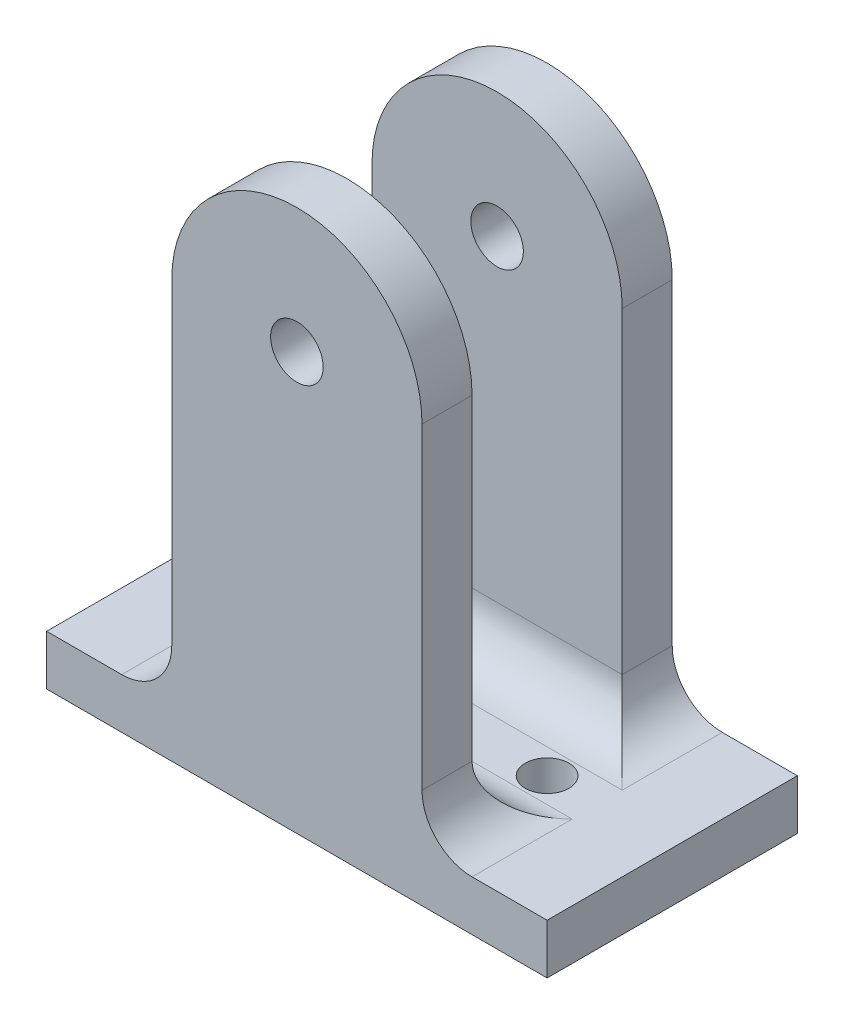
ISO-10303-21;
HEADER;
FILE_DESCRIPTION(('STEP AP214'),'2;1');
FILE_NAME('part.step','',(''),(''),'','','');
FILE_SCHEMA(('AUTOMOTIVE_DESIGN { 1 0 10303 214 1 1 1 1 }'));
ENDSEC;
DATA;
#1=APPLICATION_CONTEXT('core data for automotive mechanical design processes');
#2=APPLICATION_PROTOCOL_DEFINITION('international standard','automotive_design',2000,#1);
#3=PRODUCT_CONTEXT('',#1,'mechanical');
#4=PRODUCT('Part','Part','',(#3));
#5=PRODUCT_RELATED_PRODUCT_CATEGORY('part','',(#4));
#6=PRODUCT_DEFINITION_FORMATION('','',#4);
#7=PRODUCT_DEFINITION_CONTEXT('part definition',#1,'design');
#8=PRODUCT_DEFINITION('design','',#6,#7);
#9=PRODUCT_DEFINITION_SHAPE('','',#8);
#10=(LENGTH_UNIT() NAMED_UNIT(*) SI_UNIT(.MILLI.,.METRE.));
#11=(NAMED_UNIT(*) PLANE_ANGLE_UNIT() SI_UNIT($,.RADIAN.));
#12=(NAMED_UNIT(*) SI_UNIT($,.STERADIAN.) SOLID_ANGLE_UNIT());
#13=UNCERTAINTY_MEASURE_WITH_UNIT(LENGTH_MEASURE(1.E-05),#10,'distance_accuracy_value','');
#14=(GEOMETRIC_REPRESENTATION_CONTEXT(3) GLOBAL_UNCERTAINTY_ASSIGNED_CONTEXT((#13)) GLOBAL_UNIT_ASSIGNED_CONTEXT((#10,
#11,#12)) REPRESENTATION_CONTEXT('',''));
#15=CARTESIAN_POINT('',(0.,0.,0.));
#16=DIRECTION('',(0.,0.,1.));
#17=DIRECTION('',(1.,0.,0.));
#18=AXIS2_PLACEMENT_3D('',#15,#16,#17);
#19=CARTESIAN_POINT('',(0.,7.62,0.));
#20=DIRECTION('',(0.,-1.,0.));
#21=DIRECTION('',(0.,0.,-1.));
#22=AXIS2_PLACEMENT_3D('',#19,#20,#21);
#23=PLANE('',#22);
#24=CARTESIAN_POINT('',(57.15,7.62,-19.05));
#25=DIRECTION('',(0.,1.,0.));
#26=DIRECTION('',(0.,0.,-1.));
#27=AXIS2_PLACEMENT_3D('',#24,#25,#26);
#28=CIRCLE('',#27,3.3274);
#29=CARTESIAN_POINT('',(57.15,7.62,-22.3774));
#30=VERTEX_POINT('',#29);
#31=EDGE_CURVE('E219',#30,#30,#28,.T.);
#32=ORIENTED_EDGE('',*,*,#31,.F.);
#33=EDGE_LOOP('',(#32));
#34=FACE_BOUND('',#33,.T.);
#35=CARTESIAN_POINT('',(19.05,7.62,-19.05));
#36=DIRECTION('',(0.,1.,0.));
#37=DIRECTION('',(0.,0.,1.));
#38=AXIS2_PLACEMENT_3D('',#35,#36,#37);
#39=CIRCLE('',#38,3.3274);
#40=CARTESIAN_POINT('',(19.05,7.62,-15.7226));
#41=VERTEX_POINT('',#40);
#42=EDGE_CURVE('E226',#41,#41,#39,.T.);
#43=ORIENTED_EDGE('',*,*,#42,.F.);
#44=EDGE_LOOP('',(#43));
#45=FACE_BOUND('',#44,.T.);
#46=DIRECTION('',(-1.,0.,0.));
#47=VECTOR('',#46,1.);
#48=CARTESIAN_POINT('',(0.,7.62,-22.86));
#49=LINE('',#48,#47);
#50=CARTESIAN_POINT('',(64.77,7.62,-22.86));
#51=VERTEX_POINT('',#50);
#52=CARTESIAN_POINT('',(11.43,7.62,-22.86));
#53=VERTEX_POINT('',#52);
#54=EDGE_CURVE('E286',#51,#53,#49,.T.);
#55=ORIENTED_EDGE('',*,*,#54,.T.);
#56=DIRECTION('',(0.,0.,1.));
#57=VECTOR('',#56,1.);
#58=CARTESIAN_POINT('',(11.43,7.62,-38.1));
#59=LINE('',#58,#57);
#60=CARTESIAN_POINT('',(11.43,7.62,-38.1));
#61=VERTEX_POINT('',#60);
#62=EDGE_CURVE('E290',#53,#61,#59,.F.);
#63=ORIENTED_EDGE('',*,*,#62,.T.);
#64=DIRECTION('',(-1.,0.,0.));
#65=VECTOR('',#64,1.);
#66=CARTESIAN_POINT('',(0.,7.62,-38.1));
#67=LINE('',#66,#65);
#68=CARTESIAN_POINT('',(0.,7.62,-38.1));
#69=VERTEX_POINT('',#68);
#70=EDGE_CURVE('E242',#61,#69,#67,.T.);
#71=ORIENTED_EDGE('',*,*,#70,.T.);
#72=DIRECTION('',(0.,0.,1.));
#73=VECTOR('',#72,1.);
#74=CARTESIAN_POINT('',(0.,7.62,0.));
#75=LINE('',#74,#73);
#76=CARTESIAN_POINT('',(0.,7.62,0.));
#77=VERTEX_POINT('',#76);
#78=EDGE_CURVE('E232',#69,#77,#75,.T.);
#79=ORIENTED_EDGE('',*,*,#78,.T.);
#80=DIRECTION('',(1.,0.,0.));
#81=VECTOR('',#80,1.);
#82=CARTESIAN_POINT('',(0.,7.62,0.));
#83=LINE('',#82,#81);
#84=CARTESIAN_POINT('',(11.43,7.62,0.));
#85=VERTEX_POINT('',#84);
#86=EDGE_CURVE('E237',#77,#85,#83,.T.);
#87=ORIENTED_EDGE('',*,*,#86,.T.);
#88=DIRECTION('',(0.,0.,-1.));
#89=VECTOR('',#88,1.);
#90=CARTESIAN_POINT('',(11.43,7.62,0.));
#91=LINE('',#90,#89);
#92=CARTESIAN_POINT('',(11.43,7.62,-15.24));
#93=VERTEX_POINT('',#92);
#94=EDGE_CURVE('E269',#85,#93,#91,.T.);
#95=ORIENTED_EDGE('',*,*,#94,.T.);
#96=DIRECTION('',(1.,0.,0.));
#97=VECTOR('',#96,1.);
#98=CARTESIAN_POINT('',(0.,7.62,-15.24));
#99=LINE('',#98,#97);
#100=CARTESIAN_POINT('',(64.77,7.62,-15.24));
#101=VERTEX_POINT('',#100);
#102=EDGE_CURVE('E265',#93,#101,#99,.T.);
#103=ORIENTED_EDGE('',*,*,#102,.T.);
#104=DIRECTION('',(0.,0.,1.));
#105=VECTOR('',#104,1.);
#106=CARTESIAN_POINT('',(64.77,7.62,0.));
#107=LINE('',#106,#105);
#108=CARTESIAN_POINT('',(64.77,7.62,0.));
#109=VERTEX_POINT('',#108);
#110=EDGE_CURVE('E267',#101,#109,#107,.T.);
#111=ORIENTED_EDGE('',*,*,#110,.T.);
#112=CARTESIAN_POINT('',(76.2,7.62,0.));
#113=VERTEX_POINT('',#112);
#114=EDGE_CURVE('E235',#109,#113,#83,.T.);
#115=ORIENTED_EDGE('',*,*,#114,.T.);
#116=DIRECTION('',(0.,0.,-1.));
#117=VECTOR('',#116,1.);
#118=CARTESIAN_POINT('',(76.2,7.62,0.));
#119=LINE('',#118,#117);
#120=CARTESIAN_POINT('',(76.2,7.62,-38.1));
#121=VERTEX_POINT('',#120);
#122=EDGE_CURVE('E240',#113,#121,#119,.T.);
#123=ORIENTED_EDGE('',*,*,#122,.T.);
#124=CARTESIAN_POINT('',(64.77,7.62,-38.1));
#125=VERTEX_POINT('',#124);
#126=EDGE_CURVE('E243',#121,#125,#67,.T.);
#127=ORIENTED_EDGE('',*,*,#126,.T.);
#128=DIRECTION('',(0.,0.,-1.));
#129=VECTOR('',#128,1.);
#130=CARTESIAN_POINT('',(64.77,7.62,-30.48));
#131=LINE('',#130,#129);
#132=EDGE_CURVE('E288',#125,#51,#131,.F.);
#133=ORIENTED_EDGE('',*,*,#132,.T.);
#134=EDGE_LOOP('',(#55,#63,#71,#79,#87,#95,#103,#111,#115,#123,#127,#133));
#135=FACE_BOUND('',#134,.T.);
#136=ADVANCED_FACE('F40',(#34,#45,#135),#23,.F.);
#137=CARTESIAN_POINT('',(0.,0.,0.));
#138=DIRECTION('',(0.,-1.,0.));
#139=DIRECTION('',(0.,0.,-1.));
#140=AXIS2_PLACEMENT_3D('',#137,#138,#139);
#141=PLANE('',#140);
#142=DIRECTION('',(0.,0.,1.));
#143=VECTOR('',#142,1.);
#144=CARTESIAN_POINT('',(0.,0.,0.));
#145=LINE('',#144,#143);
#146=CARTESIAN_POINT('',(0.,0.,-38.1));
#147=VERTEX_POINT('',#146);
#148=CARTESIAN_POINT('',(0.,0.,0.));
#149=VERTEX_POINT('',#148);
#150=EDGE_CURVE('E229',#147,#149,#145,.T.);
#151=ORIENTED_EDGE('',*,*,#150,.F.);
#152=DIRECTION('',(-1.,0.,0.));
#153=VECTOR('',#152,1.);
#154=CARTESIAN_POINT('',(0.,0.,-38.1));
#155=LINE('',#154,#153);
#156=CARTESIAN_POINT('',(76.2,0.,-38.1));
#157=VERTEX_POINT('',#156);
#158=EDGE_CURVE('E236',#157,#147,#155,.T.);
#159=ORIENTED_EDGE('',*,*,#158,.F.);
#160=DIRECTION('',(0.,0.,-1.));
#161=VECTOR('',#160,1.);
#162=CARTESIAN_POINT('',(76.2,0.,0.));
#163=LINE('',#162,#161);
#164=CARTESIAN_POINT('',(76.2,0.,0.));
#165=VERTEX_POINT('',#164);
#166=EDGE_CURVE('E251',#165,#157,#163,.T.);
#167=ORIENTED_EDGE('',*,*,#166,.F.);
#168=DIRECTION('',(1.,0.,0.));
#169=VECTOR('',#168,1.);
#170=CARTESIAN_POINT('',(0.,0.,0.));
#171=LINE('',#170,#169);
#172=EDGE_CURVE('E249',#149,#165,#171,.T.);
#173=ORIENTED_EDGE('',*,*,#172,.F.);
#174=EDGE_LOOP('',(#151,#159,#167,#173));
#175=FACE_BOUND('',#174,.T.);
#176=CARTESIAN_POINT('',(19.05,0.,-19.05));
#177=DIRECTION('',(0.,1.,0.));
#178=DIRECTION('',(0.,0.,1.));
#179=AXIS2_PLACEMENT_3D('',#176,#177,#178);
#180=CIRCLE('',#179,3.3274);
#181=CARTESIAN_POINT('',(19.05,0.,-15.7226));
#182=VERTEX_POINT('',#181);
#183=EDGE_CURVE('E223',#182,#182,#180,.T.);
#184=ORIENTED_EDGE('',*,*,#183,.T.);
#185=EDGE_LOOP('',(#184));
#186=FACE_BOUND('',#185,.T.);
#187=CARTESIAN_POINT('',(57.15,0.,-19.05));
#188=DIRECTION('',(0.,1.,0.));
#189=DIRECTION('',(0.,0.,-1.));
#190=AXIS2_PLACEMENT_3D('',#187,#188,#189);
#191=CIRCLE('',#190,3.3274);
#192=CARTESIAN_POINT('',(57.15,0.,-22.3774));
#193=VERTEX_POINT('',#192);
#194=EDGE_CURVE('E217',#193,#193,#191,.T.);
#195=ORIENTED_EDGE('',*,*,#194,.T.);
#196=EDGE_LOOP('',(#195));
#197=FACE_BOUND('',#196,.T.);
#198=ADVANCED_FACE('F325',(#175,#186,#197),#141,.T.);
#199=CARTESIAN_POINT('',(0.,7.62,0.));
#200=DIRECTION('',(1.,0.,0.));
#201=DIRECTION('',(0.,0.,-1.));
#202=AXIS2_PLACEMENT_3D('',#199,#200,#201);
#203=PLANE('',#202);
#204=ORIENTED_EDGE('',*,*,#150,.T.);
#205=DIRECTION('',(0.,-1.,0.));
#206=VECTOR('',#205,1.);
#207=CARTESIAN_POINT('',(0.,7.62,0.));
#208=LINE('',#207,#206);
#209=EDGE_CURVE('E262',#77,#149,#208,.T.);
#210=ORIENTED_EDGE('',*,*,#209,.F.);
#211=ORIENTED_EDGE('',*,*,#78,.F.);
#212=DIRECTION('',(0.,-1.,0.));
#213=VECTOR('',#212,1.);
#214=CARTESIAN_POINT('',(0.,7.62,-38.1));
#215=LINE('',#214,#213);
#216=EDGE_CURVE('E246',#69,#147,#215,.T.);
#217=ORIENTED_EDGE('',*,*,#216,.T.);
#218=EDGE_LOOP('',(#204,#210,#211,#217));
#219=FACE_BOUND('',#218,.T.);
#220=ADVANCED_FACE('F331',(#219),#203,.F.);
#221=CARTESIAN_POINT('',(0.,7.62,0.));
#222=DIRECTION('',(0.,0.,-1.));
#223=DIRECTION('',(-1.,0.,0.));
#224=AXIS2_PLACEMENT_3D('',#221,#222,#223);
#225=PLANE('',#224);
#226=ORIENTED_EDGE('',*,*,#114,.F.);
#227=CARTESIAN_POINT('',(64.77,15.24,0.));
#228=DIRECTION('',(0.,0.,-1.));
#229=DIRECTION('',(-1.,0.,0.));
#230=AXIS2_PLACEMENT_3D('',#227,#228,#229);
#231=CIRCLE('',#230,7.62);
#232=CARTESIAN_POINT('',(57.15,15.24,0.));
#233=VERTEX_POINT('',#232);
#234=EDGE_CURVE('E280',#109,#233,#231,.T.);
#235=ORIENTED_EDGE('',*,*,#234,.T.);
#236=DIRECTION('',(0.,1.,0.));
#237=VECTOR('',#236,1.);
#238=CARTESIAN_POINT('',(57.15,0.,0.));
#239=LINE('',#238,#237);
#240=CARTESIAN_POINT('',(57.15,63.5,0.));
#241=VERTEX_POINT('',#240);
#242=EDGE_CURVE('E194',#233,#241,#239,.T.);
#243=ORIENTED_EDGE('',*,*,#242,.T.);
#244=CARTESIAN_POINT('',(38.1,63.5,0.));
#245=DIRECTION('',(0.,0.,1.));
#246=DIRECTION('',(-1.,0.,0.));
#247=AXIS2_PLACEMENT_3D('',#244,#245,#246);
#248=CIRCLE('',#247,19.05);
#249=CARTESIAN_POINT('',(19.05,63.5,0.));
#250=VERTEX_POINT('',#249);
#251=EDGE_CURVE('E210',#241,#250,#248,.T.);
#252=ORIENTED_EDGE('',*,*,#251,.T.);
#253=DIRECTION('',(0.,-1.,0.));
#254=VECTOR('',#253,1.);
#255=CARTESIAN_POINT('',(19.05,0.,0.));
#256=LINE('',#255,#254);
#257=CARTESIAN_POINT('',(19.05,15.24,0.));
#258=VERTEX_POINT('',#257);
#259=EDGE_CURVE('E202',#250,#258,#256,.T.);
#260=ORIENTED_EDGE('',*,*,#259,.T.);
#261=CARTESIAN_POINT('',(11.43,15.24,0.));
#262=DIRECTION('',(0.,0.,-1.));
#263=DIRECTION('',(-1.,0.,0.));
#264=AXIS2_PLACEMENT_3D('',#261,#262,#263);
#265=CIRCLE('',#264,7.62);
#266=EDGE_CURVE('E278',#258,#85,#265,.T.);
#267=ORIENTED_EDGE('',*,*,#266,.T.);
#268=ORIENTED_EDGE('',*,*,#86,.F.);
#269=ORIENTED_EDGE('',*,*,#209,.T.);
#270=ORIENTED_EDGE('',*,*,#172,.T.);
#271=DIRECTION('',(0.,-1.,0.));
#272=VECTOR('',#271,1.);
#273=CARTESIAN_POINT('',(76.2,7.62,0.));
#274=LINE('',#273,#272);
#275=EDGE_CURVE('E259',#113,#165,#274,.T.);
#276=ORIENTED_EDGE('',*,*,#275,.F.);
#277=EDGE_LOOP('',(#226,#235,#243,#252,#260,#267,#268,#269,#270,#276));
#278=FACE_BOUND('',#277,.T.);
#279=CARTESIAN_POINT('',(38.1,63.5,0.));
#280=DIRECTION('',(0.,0.,1.));
#281=DIRECTION('',(1.,0.,0.));
#282=AXIS2_PLACEMENT_3D('',#279,#280,#281);
#283=CIRCLE('',#282,4.00000000000001);
#284=CARTESIAN_POINT('',(42.1,63.5,0.));
#285=VERTEX_POINT('',#284);
#286=EDGE_CURVE('E195',#285,#285,#283,.T.);
#287=ORIENTED_EDGE('',*,*,#286,.F.);
#288=EDGE_LOOP('',(#287));
#289=FACE_BOUND('',#288,.T.);
#290=ADVANCED_FACE('F347',(#278,#289),#225,.F.);
#291=CARTESIAN_POINT('',(76.2,7.62,0.));
#292=DIRECTION('',(-1.,0.,0.));
#293=DIRECTION('',(0.,0.,1.));
#294=AXIS2_PLACEMENT_3D('',#291,#292,#293);
#295=PLANE('',#294);
#296=ORIENTED_EDGE('',*,*,#166,.T.);
#297=DIRECTION('',(0.,-1.,0.));
#298=VECTOR('',#297,1.);
#299=CARTESIAN_POINT('',(76.2,7.62,-38.1));
#300=LINE('',#299,#298);
#301=EDGE_CURVE('E256',#121,#157,#300,.T.);
#302=ORIENTED_EDGE('',*,*,#301,.F.);
#303=ORIENTED_EDGE('',*,*,#122,.F.);
#304=ORIENTED_EDGE('',*,*,#275,.T.);
#305=EDGE_LOOP('',(#296,#302,#303,#304));
#306=FACE_BOUND('',#305,.T.);
#307=ADVANCED_FACE('F343',(#306),#295,.F.);
#308=CARTESIAN_POINT('',(0.,7.62,-38.1));
#309=DIRECTION('',(0.,0.,1.));
#310=DIRECTION('',(1.,0.,0.));
#311=AXIS2_PLACEMENT_3D('',#308,#309,#310);
#312=PLANE('',#311);
#313=ORIENTED_EDGE('',*,*,#70,.F.);
#314=CARTESIAN_POINT('',(11.43,15.24,-38.1));
#315=DIRECTION('',(0.,0.,1.));
#316=DIRECTION('',(1.,0.,0.));
#317=AXIS2_PLACEMENT_3D('',#314,#315,#316);
#318=CIRCLE('',#317,7.62);
#319=CARTESIAN_POINT('',(19.05,15.24,-38.1));
#320=VERTEX_POINT('',#319);
#321=EDGE_CURVE('E49',#61,#320,#318,.T.);
#322=ORIENTED_EDGE('',*,*,#321,.T.);
#323=DIRECTION('',(0.,-1.,0.));
#324=VECTOR('',#323,1.);
#325=CARTESIAN_POINT('',(19.05,0.,-38.1));
#326=LINE('',#325,#324);
#327=CARTESIAN_POINT('',(19.05,63.5,-38.1));
#328=VERTEX_POINT('',#327);
#329=EDGE_CURVE('E185',#328,#320,#326,.T.);
#330=ORIENTED_EDGE('',*,*,#329,.F.);
#331=CARTESIAN_POINT('',(38.1,63.5,-38.1));
#332=DIRECTION('',(0.,0.,1.));
#333=DIRECTION('',(-1.,0.,0.));
#334=AXIS2_PLACEMENT_3D('',#331,#332,#333);
#335=CIRCLE('',#334,19.05);
#336=CARTESIAN_POINT('',(57.15,63.5,-38.1));
#337=VERTEX_POINT('',#336);
#338=EDGE_CURVE('E167',#337,#328,#335,.T.);
#339=ORIENTED_EDGE('',*,*,#338,.F.);
#340=DIRECTION('',(0.,1.,0.));
#341=VECTOR('',#340,1.);
#342=CARTESIAN_POINT('',(57.15,0.,-38.1));
#343=LINE('',#342,#341);
#344=CARTESIAN_POINT('',(57.15,15.24,-38.1));
#345=VERTEX_POINT('',#344);
#346=EDGE_CURVE('E177',#345,#337,#343,.T.);
#347=ORIENTED_EDGE('',*,*,#346,.F.);
#348=CARTESIAN_POINT('',(64.77,15.24,-38.1));
#349=DIRECTION('',(0.,0.,1.));
#350=DIRECTION('',(1.,0.,0.));
#351=AXIS2_PLACEMENT_3D('',#348,#349,#350);
#352=CIRCLE('',#351,7.62);
#353=EDGE_CURVE('E12',#345,#125,#352,.T.);
#354=ORIENTED_EDGE('',*,*,#353,.T.);
#355=ORIENTED_EDGE('',*,*,#126,.F.);
#356=ORIENTED_EDGE('',*,*,#301,.T.);
#357=ORIENTED_EDGE('',*,*,#158,.T.);
#358=ORIENTED_EDGE('',*,*,#216,.F.);
#359=EDGE_LOOP('',(#313,#322,#330,#339,#347,#354,#355,#356,#357,#358));
#360=FACE_BOUND('',#359,.T.);
#361=CARTESIAN_POINT('',(38.1,63.5,-38.1));
#362=DIRECTION('',(0.,0.,1.));
#363=DIRECTION('',(1.,0.,0.));
#364=AXIS2_PLACEMENT_3D('',#361,#362,#363);
#365=CIRCLE('',#364,4.00000000000001);
#366=CARTESIAN_POINT('',(34.1,63.5,-38.1));
#367=VERTEX_POINT('',#366);
#368=EDGE_CURVE('E181',#367,#367,#365,.T.);
#369=ORIENTED_EDGE('',*,*,#368,.T.);
#370=EDGE_LOOP('',(#369));
#371=FACE_BOUND('',#370,.T.);
#372=ADVANCED_FACE('F340',(#360,#371),#312,.F.);
#373=CARTESIAN_POINT('',(19.05,7.62,-19.05));
#374=DIRECTION('',(0.,-1.,0.));
#375=DIRECTION('',(0.,0.,-1.));
#376=AXIS2_PLACEMENT_3D('',#373,#374,#375);
#377=CYLINDRICAL_SURFACE('',#376,3.3274);
#378=ORIENTED_EDGE('',*,*,#42,.T.);
#379=EDGE_LOOP('',(#378));
#380=FACE_BOUND('',#379,.T.);
#381=ORIENTED_EDGE('',*,*,#183,.F.);
#382=EDGE_LOOP('',(#381));
#383=FACE_BOUND('',#382,.T.);
#384=ADVANCED_FACE('F337',(#380,#383),#377,.F.);
#385=CARTESIAN_POINT('',(57.15,7.62,-19.05));
#386=DIRECTION('',(0.,-1.,0.));
#387=DIRECTION('',(0.,0.,-1.));
#388=AXIS2_PLACEMENT_3D('',#385,#386,#387);
#389=CYLINDRICAL_SURFACE('',#388,3.3274);
#390=ORIENTED_EDGE('',*,*,#31,.T.);
#391=EDGE_LOOP('',(#390));
#392=FACE_BOUND('',#391,.T.);
#393=ORIENTED_EDGE('',*,*,#194,.F.);
#394=EDGE_LOOP('',(#393));
#395=FACE_BOUND('',#394,.T.);
#396=ADVANCED_FACE('F418',(#392,#395),#389,.F.);
#397=CARTESIAN_POINT('',(38.1,63.5,-7.62));
#398=DIRECTION('',(0.,0.,-1.));
#399=DIRECTION('',(-1.,0.,0.));
#400=AXIS2_PLACEMENT_3D('',#397,#398,#399);
#401=PLANE('',#400);
#402=CARTESIAN_POINT('',(38.1,63.5,-7.62));
#403=DIRECTION('',(0.,0.,1.));
#404=DIRECTION('',(1.,0.,0.));
#405=AXIS2_PLACEMENT_3D('',#402,#403,#404);
#406=CIRCLE('',#405,4.00000000000001);
#407=CARTESIAN_POINT('',(42.1,63.5,-7.62));
#408=VERTEX_POINT('',#407);
#409=EDGE_CURVE('E191',#408,#408,#406,.T.);
#410=ORIENTED_EDGE('',*,*,#409,.T.);
#411=EDGE_LOOP('',(#410));
#412=FACE_BOUND('',#411,.T.);
#413=DIRECTION('',(0.,1.,0.));
#414=VECTOR('',#413,1.);
#415=CARTESIAN_POINT('',(57.15,0.,-7.62));
#416=LINE('',#415,#414);
#417=CARTESIAN_POINT('',(57.15,15.24,-7.62));
#418=VERTEX_POINT('',#417);
#419=CARTESIAN_POINT('',(57.15,63.5,-7.62));
#420=VERTEX_POINT('',#419);
#421=EDGE_CURVE('E199',#418,#420,#416,.T.);
#422=ORIENTED_EDGE('',*,*,#421,.F.);
#423=DIRECTION('',(1.,0.,0.));
#424=VECTOR('',#423,1.);
#425=CARTESIAN_POINT('',(38.1,15.24,-7.62));
#426=LINE('',#425,#424);
#427=CARTESIAN_POINT('',(19.05,15.24,-7.62));
#428=VERTEX_POINT('',#427);
#429=EDGE_CURVE('E276',#418,#428,#426,.F.);
#430=ORIENTED_EDGE('',*,*,#429,.T.);
#431=DIRECTION('',(0.,-1.,0.));
#432=VECTOR('',#431,1.);
#433=CARTESIAN_POINT('',(19.05,0.,-7.62));
#434=LINE('',#433,#432);
#435=CARTESIAN_POINT('',(19.05,63.5,-7.62));
#436=VERTEX_POINT('',#435);
#437=EDGE_CURVE('E205',#436,#428,#434,.T.);
#438=ORIENTED_EDGE('',*,*,#437,.F.);
#439=CARTESIAN_POINT('',(38.1,63.5,-7.62));
#440=DIRECTION('',(0.,0.,1.));
#441=DIRECTION('',(-1.,0.,0.));
#442=AXIS2_PLACEMENT_3D('',#439,#440,#441);
#443=CIRCLE('',#442,19.05);
#444=EDGE_CURVE('E201',#420,#436,#443,.T.);
#445=ORIENTED_EDGE('',*,*,#444,.F.);
#446=EDGE_LOOP('',(#422,#430,#438,#445));
#447=FACE_BOUND('',#446,.T.);
#448=ADVANCED_FACE('F416',(#412,#447),#401,.T.);
#449=CARTESIAN_POINT('',(19.05,0.,-7.62));
#450=DIRECTION('',(-1.,0.,0.));
#451=DIRECTION('',(0.,0.,1.));
#452=AXIS2_PLACEMENT_3D('',#449,#450,#451);
#453=PLANE('',#452);
#454=ORIENTED_EDGE('',*,*,#437,.T.);
#455=DIRECTION('',(0.,0.,-1.));
#456=VECTOR('',#455,1.);
#457=CARTESIAN_POINT('',(19.05,15.24,-7.62));
#458=LINE('',#457,#456);
#459=EDGE_CURVE('E272',#428,#258,#458,.F.);
#460=ORIENTED_EDGE('',*,*,#459,.T.);
#461=ORIENTED_EDGE('',*,*,#259,.F.);
#462=DIRECTION('',(0.,0.,1.));
#463=VECTOR('',#462,1.);
#464=CARTESIAN_POINT('',(19.05,63.5,-7.62));
#465=LINE('',#464,#463);
#466=EDGE_CURVE('E215',#436,#250,#465,.T.);
#467=ORIENTED_EDGE('',*,*,#466,.F.);
#468=EDGE_LOOP('',(#454,#460,#461,#467));
#469=FACE_BOUND('',#468,.T.);
#470=ADVANCED_FACE('F413',(#469),#453,.T.);
#471=CARTESIAN_POINT('',(57.15,0.,-7.62));
#472=DIRECTION('',(1.,0.,0.));
#473=DIRECTION('',(0.,0.,-1.));
#474=AXIS2_PLACEMENT_3D('',#471,#472,#473);
#475=PLANE('',#474);
#476=ORIENTED_EDGE('',*,*,#242,.F.);
#477=DIRECTION('',(0.,0.,1.));
#478=VECTOR('',#477,1.);
#479=CARTESIAN_POINT('',(57.15,15.24,-7.62));
#480=LINE('',#479,#478);
#481=EDGE_CURVE('E274',#233,#418,#480,.F.);
#482=ORIENTED_EDGE('',*,*,#481,.T.);
#483=ORIENTED_EDGE('',*,*,#421,.T.);
#484=DIRECTION('',(0.,0.,1.));
#485=VECTOR('',#484,1.);
#486=CARTESIAN_POINT('',(57.15,63.5,-7.62));
#487=LINE('',#486,#485);
#488=EDGE_CURVE('E208',#420,#241,#487,.T.);
#489=ORIENTED_EDGE('',*,*,#488,.T.);
#490=EDGE_LOOP('',(#476,#482,#483,#489));
#491=FACE_BOUND('',#490,.T.);
#492=ADVANCED_FACE('F404',(#491),#475,.T.);
#493=CARTESIAN_POINT('',(38.1,63.5,-7.62));
#494=DIRECTION('',(0.,0.,1.));
#495=DIRECTION('',(1.,0.,0.));
#496=AXIS2_PLACEMENT_3D('',#493,#494,#495);
#497=CYLINDRICAL_SURFACE('',#496,19.05);
#498=ORIENTED_EDGE('',*,*,#251,.F.);
#499=ORIENTED_EDGE('',*,*,#488,.F.);
#500=ORIENTED_EDGE('',*,*,#444,.T.);
#501=ORIENTED_EDGE('',*,*,#466,.T.);
#502=EDGE_LOOP('',(#498,#499,#500,#501));
#503=FACE_BOUND('',#502,.T.);
#504=ADVANCED_FACE('F410',(#503),#497,.T.);
#505=CARTESIAN_POINT('',(38.1,63.5,-7.62));
#506=DIRECTION('',(0.,0.,1.));
#507=DIRECTION('',(1.,0.,0.));
#508=AXIS2_PLACEMENT_3D('',#505,#506,#507);
#509=CYLINDRICAL_SURFACE('',#508,4.00000000000001);
#510=CARTESIAN_POINT('',(42.1,63.5,-7.62));
#511=CARTESIAN_POINT('',(42.1,63.5,-7.540625));
#512=CARTESIAN_POINT('',(42.1,63.5,-7.46125));
#513=CARTESIAN_POINT('',(42.1,63.5,-7.3025));
#514=CARTESIAN_POINT('',(42.1,63.5,-7.223125));
#515=CARTESIAN_POINT('',(42.1,63.5,-7.064375));
#516=CARTESIAN_POINT('',(42.1,63.5,-6.985));
#517=CARTESIAN_POINT('',(42.1,63.5,-6.82625));
#518=CARTESIAN_POINT('',(42.1,63.5,-6.746875));
#519=CARTESIAN_POINT('',(42.1,63.5,-6.588125));
#520=CARTESIAN_POINT('',(42.1,63.5,-6.50875));
#521=CARTESIAN_POINT('',(42.1,63.5,-6.35));
#522=CARTESIAN_POINT('',(42.1,63.5,-6.270625));
#523=CARTESIAN_POINT('',(42.1,63.5,-6.111875));
#524=CARTESIAN_POINT('',(42.1,63.5,-6.0325));
#525=CARTESIAN_POINT('',(42.1,63.5,-5.87375));
#526=CARTESIAN_POINT('',(42.1,63.5,-5.794375));
#527=CARTESIAN_POINT('',(42.1,63.5,-5.635625));
#528=CARTESIAN_POINT('',(42.1,63.5,-5.55625));
#529=CARTESIAN_POINT('',(42.1,63.5,-5.3975));
#530=CARTESIAN_POINT('',(42.1,63.5,-5.318125));
#531=CARTESIAN_POINT('',(42.1,63.5,-5.159375));
#532=CARTESIAN_POINT('',(42.1,63.5,-5.08));
#533=CARTESIAN_POINT('',(42.1,63.5,-4.92125));
#534=CARTESIAN_POINT('',(42.1,63.5,-4.841875));
#535=CARTESIAN_POINT('',(42.1,63.5,-4.683125));
#536=CARTESIAN_POINT('',(42.1,63.5,-4.60375));
#537=CARTESIAN_POINT('',(42.1,63.5,-4.445));
#538=CARTESIAN_POINT('',(42.1,63.5,-4.365625));
#539=CARTESIAN_POINT('',(42.1,63.5,-4.206875));
#540=CARTESIAN_POINT('',(42.1,63.5,-4.1275));
#541=CARTESIAN_POINT('',(42.1,63.5,-3.96875));
#542=CARTESIAN_POINT('',(42.1,63.5,-3.889375));
#543=CARTESIAN_POINT('',(42.1,63.5,-3.730625));
#544=CARTESIAN_POINT('',(42.1,63.5,-3.65125));
#545=CARTESIAN_POINT('',(42.1,63.5,-3.4925));
#546=CARTESIAN_POINT('',(42.1,63.5,-3.413125));
#547=CARTESIAN_POINT('',(42.1,63.5,-3.254375));
#548=CARTESIAN_POINT('',(42.1,63.5,-3.175));
#549=CARTESIAN_POINT('',(42.1,63.5,-3.01625));
#550=CARTESIAN_POINT('',(42.1,63.5,-2.936875));
#551=CARTESIAN_POINT('',(42.1,63.5,-2.778125));
#552=CARTESIAN_POINT('',(42.1,63.5,-2.69875));
#553=CARTESIAN_POINT('',(42.1,63.5,-2.54));
#554=CARTESIAN_POINT('',(42.1,63.5,-2.460625));
#555=CARTESIAN_POINT('',(42.1,63.5,-2.301875));
#556=CARTESIAN_POINT('',(42.1,63.5,-2.2225));
#557=CARTESIAN_POINT('',(42.1,63.5,-2.06375));
#558=CARTESIAN_POINT('',(42.1,63.5,-1.984375));
#559=CARTESIAN_POINT('',(42.1,63.5,-1.825625));
#560=CARTESIAN_POINT('',(42.1,63.5,-1.74625));
#561=CARTESIAN_POINT('',(42.1,63.5,-1.5875));
#562=CARTESIAN_POINT('',(42.1,63.5,-1.508125));
#563=CARTESIAN_POINT('',(42.1,63.5,-1.349375));
#564=CARTESIAN_POINT('',(42.1,63.5,-1.27));
#565=CARTESIAN_POINT('',(42.1,63.5,-1.11125));
#566=CARTESIAN_POINT('',(42.1,63.5,-1.031875));
#567=CARTESIAN_POINT('',(42.1,63.5,-0.873125));
#568=CARTESIAN_POINT('',(42.1,63.5,-0.79375));
#569=CARTESIAN_POINT('',(42.1,63.5,-0.635));
#570=CARTESIAN_POINT('',(42.1,63.5,-0.555625));
#571=CARTESIAN_POINT('',(42.1,63.5,-0.396875));
#572=CARTESIAN_POINT('',(42.1,63.5,-0.3175));
#573=CARTESIAN_POINT('',(42.1,63.5,-0.15875));
#574=CARTESIAN_POINT('',(42.1,63.5,-0.0793749999999999));
#575=CARTESIAN_POINT('',(42.1,63.5,0.));
#576=B_SPLINE_CURVE_WITH_KNOTS('',3,(#510,#511,#512,#513,#514,#515,#516,#517,#518,#519,#520,
#521,#522,#523,#524,#525,#526,#527,#528,#529,#530,#531,#532,#533,#534,#535,#536,#537,#538,#539,
#540,#541,#542,#543,#544,#545,#546,#547,#548,#549,#550,#551,#552,#553,#554,#555,#556,#557,#558,
#559,#560,#561,#562,#563,#564,#565,#566,#567,#568,#569,#570,#571,#572,#573,#574,#575),
.UNSPECIFIED.,.F.,.F.,(4,2,2,2,2,2,2,2,2,2,2,2,2,2,2,2,2,2,2,2,2,2,2,2,2,2,2,2,2,2,2,2,4),(0.,
0.238125,0.476249999999999,0.714375,0.952499999999999,1.190625,1.42875,1.666875,1.905,2.143125,
2.38125,2.619375,2.8575,3.095625,3.33375,3.571875,3.81,4.048125,4.28625,4.524375,4.7625,
5.000625,5.23875,5.476875,5.715,5.953125,6.19125,6.429375,6.6675,6.905625,7.14375,7.381875,
7.62),.UNSPECIFIED.);
#577=EDGE_CURVE('BSEAM361',#408,#285,#576,.T.);
#578=ORIENTED_EDGE('',*,*,#409,.F.);
#579=ORIENTED_EDGE('',*,*,#286,.T.);
#580=ORIENTED_EDGE('',*,*,#577,.T.);
#581=ORIENTED_EDGE('',*,*,#577,.F.);
#582=EDGE_LOOP('',(#578,#580,#579,#581));
#583=FACE_BOUND('',#582,.T.);
#584=ADVANCED_FACE('F361',(#583),#509,.F.);
#585=CARTESIAN_POINT('',(64.77,15.24,0.));
#586=DIRECTION('',(0.,0.,1.));
#587=DIRECTION('',(1.,0.,0.));
#588=AXIS2_PLACEMENT_3D('',#585,#586,#587);
#589=CYLINDRICAL_SURFACE('',#588,7.62);
#590=ORIENTED_EDGE('',*,*,#234,.F.);
#591=ORIENTED_EDGE('',*,*,#110,.F.);
#592=CARTESIAN_POINT('',(64.77,15.24,-15.24));
#593=DIRECTION('',(0.707106781186547,0.,0.707106781186547));
#594=DIRECTION('',(0.707106781186547,0.,-0.707106781186547));
#595=AXIS2_PLACEMENT_3D('',#592,#593,#594);
#596=ELLIPSE('',#595,10.776307345283,7.62);
#597=EDGE_CURVE('E198',#418,#101,#596,.T.);
#598=ORIENTED_EDGE('',*,*,#597,.F.);
#599=ORIENTED_EDGE('',*,*,#481,.F.);
#600=EDGE_LOOP('',(#590,#591,#598,#599));
#601=FACE_BOUND('',#600,.T.);
#602=ADVANCED_FACE('F357',(#601),#589,.F.);
#603=CARTESIAN_POINT('',(0.,15.24,-15.24));
#604=DIRECTION('',(1.,0.,0.));
#605=DIRECTION('',(0.,0.,-1.));
#606=AXIS2_PLACEMENT_3D('',#603,#604,#605);
#607=CYLINDRICAL_SURFACE('',#606,7.62);
#608=ORIENTED_EDGE('',*,*,#597,.T.);
#609=ORIENTED_EDGE('',*,*,#102,.F.);
#610=CARTESIAN_POINT('',(11.43,15.24,-15.24));
#611=DIRECTION('',(0.707106781186547,0.,-0.707106781186547));
#612=DIRECTION('',(0.707106781186547,0.,0.707106781186547));
#613=AXIS2_PLACEMENT_3D('',#610,#611,#612);
#614=ELLIPSE('',#613,10.776307345283,7.62);
#615=EDGE_CURVE('E189',#428,#93,#614,.T.);
#616=ORIENTED_EDGE('',*,*,#615,.F.);
#617=ORIENTED_EDGE('',*,*,#429,.F.);
#618=EDGE_LOOP('',(#608,#609,#616,#617));
#619=FACE_BOUND('',#618,.T.);
#620=ADVANCED_FACE('F320',(#619),#607,.F.);
#621=CARTESIAN_POINT('',(11.43,15.24,0.));
#622=DIRECTION('',(0.,0.,-1.));
#623=DIRECTION('',(-1.,0.,0.));
#624=AXIS2_PLACEMENT_3D('',#621,#622,#623);
#625=CYLINDRICAL_SURFACE('',#624,7.62);
#626=ORIENTED_EDGE('',*,*,#266,.F.);
#627=ORIENTED_EDGE('',*,*,#459,.F.);
#628=ORIENTED_EDGE('',*,*,#615,.T.);
#629=ORIENTED_EDGE('',*,*,#94,.F.);
#630=EDGE_LOOP('',(#626,#627,#628,#629));
#631=FACE_BOUND('',#630,.T.);
#632=ADVANCED_FACE('F313',(#631),#625,.F.);
#633=CARTESIAN_POINT('',(38.1,63.5,-30.48));
#634=DIRECTION('',(0.,0.,1.));
#635=DIRECTION('',(-1.,0.,0.));
#636=AXIS2_PLACEMENT_3D('',#633,#634,#635);
#637=PLANE('',#636);
#638=CARTESIAN_POINT('',(38.1,63.5,-30.48));
#639=DIRECTION('',(0.,0.,1.));
#640=DIRECTION('',(1.,0.,0.));
#641=AXIS2_PLACEMENT_3D('',#638,#639,#640);
#642=CIRCLE('',#641,4.00000000000001);
#643=CARTESIAN_POINT('',(34.1,63.5,-30.48));
#644=VERTEX_POINT('',#643);
#645=EDGE_CURVE('E187',#644,#644,#642,.T.);
#646=ORIENTED_EDGE('',*,*,#645,.F.);
#647=EDGE_LOOP('',(#646));
#648=FACE_BOUND('',#647,.T.);
#649=DIRECTION('',(0.,-1.,0.));
#650=VECTOR('',#649,1.);
#651=CARTESIAN_POINT('',(19.05,0.,-30.48));
#652=LINE('',#651,#650);
#653=CARTESIAN_POINT('',(19.05,63.5,-30.48));
#654=VERTEX_POINT('',#653);
#655=CARTESIAN_POINT('',(19.05,15.24,-30.48));
#656=VERTEX_POINT('',#655);
#657=EDGE_CURVE('E157',#654,#656,#652,.T.);
#658=ORIENTED_EDGE('',*,*,#657,.T.);
#659=DIRECTION('',(-1.,0.,0.));
#660=VECTOR('',#659,1.);
#661=CARTESIAN_POINT('',(38.1,15.24,-30.48));
#662=LINE('',#661,#660);
#663=CARTESIAN_POINT('',(57.15,15.24,-30.48));
#664=VERTEX_POINT('',#663);
#665=EDGE_CURVE('E65',#656,#664,#662,.F.);
#666=ORIENTED_EDGE('',*,*,#665,.T.);
#667=DIRECTION('',(0.,1.,0.));
#668=VECTOR('',#667,1.);
#669=CARTESIAN_POINT('',(57.15,0.,-30.48));
#670=LINE('',#669,#668);
#671=CARTESIAN_POINT('',(57.15,63.5,-30.48));
#672=VERTEX_POINT('',#671);
#673=EDGE_CURVE('E158',#664,#672,#670,.T.);
#674=ORIENTED_EDGE('',*,*,#673,.T.);
#675=CARTESIAN_POINT('',(38.1,63.5,-30.48));
#676=DIRECTION('',(0.,0.,1.));
#677=DIRECTION('',(-1.,0.,0.));
#678=AXIS2_PLACEMENT_3D('',#675,#676,#677);
#679=CIRCLE('',#678,19.05);
#680=EDGE_CURVE('E153',#672,#654,#679,.T.);
#681=ORIENTED_EDGE('',*,*,#680,.T.);
#682=EDGE_LOOP('',(#658,#666,#674,#681));
#683=FACE_BOUND('',#682,.T.);
#684=ADVANCED_FACE('F155',(#648,#683),#637,.T.);
#685=CARTESIAN_POINT('',(57.15,0.,-30.48));
#686=DIRECTION('',(-1.,0.,0.));
#687=DIRECTION('',(0.,0.,1.));
#688=AXIS2_PLACEMENT_3D('',#685,#686,#687);
#689=PLANE('',#688);
#690=ORIENTED_EDGE('',*,*,#673,.F.);
#691=DIRECTION('',(0.,0.,-1.));
#692=VECTOR('',#691,1.);
#693=CARTESIAN_POINT('',(57.15,15.24,-38.1));
#694=LINE('',#693,#692);
#695=EDGE_CURVE('E57',#664,#345,#694,.T.);
#696=ORIENTED_EDGE('',*,*,#695,.T.);
#697=ORIENTED_EDGE('',*,*,#346,.T.);
#698=DIRECTION('',(0.,0.,-1.));
#699=VECTOR('',#698,1.);
#700=CARTESIAN_POINT('',(57.15,63.5,-30.48));
#701=LINE('',#700,#699);
#702=EDGE_CURVE('E171',#672,#337,#701,.T.);
#703=ORIENTED_EDGE('',*,*,#702,.F.);
#704=EDGE_LOOP('',(#690,#696,#697,#703));
#705=FACE_BOUND('',#704,.T.);
#706=ADVANCED_FACE('F312',(#705),#689,.F.);
#707=CARTESIAN_POINT('',(19.05,0.,-30.48));
#708=DIRECTION('',(1.,0.,0.));
#709=DIRECTION('',(0.,0.,-1.));
#710=AXIS2_PLACEMENT_3D('',#707,#708,#709);
#711=PLANE('',#710);
#712=ORIENTED_EDGE('',*,*,#329,.T.);
#713=DIRECTION('',(0.,0.,1.));
#714=VECTOR('',#713,1.);
#715=CARTESIAN_POINT('',(19.05,15.24,-30.48));
#716=LINE('',#715,#714);
#717=EDGE_CURVE('E176',#320,#656,#716,.T.);
#718=ORIENTED_EDGE('',*,*,#717,.T.);
#719=ORIENTED_EDGE('',*,*,#657,.F.);
#720=DIRECTION('',(0.,0.,-1.));
#721=VECTOR('',#720,1.);
#722=CARTESIAN_POINT('',(19.05,63.5,-30.48));
#723=LINE('',#722,#721);
#724=EDGE_CURVE('E164',#654,#328,#723,.T.);
#725=ORIENTED_EDGE('',*,*,#724,.T.);
#726=EDGE_LOOP('',(#712,#718,#719,#725));
#727=FACE_BOUND('',#726,.T.);
#728=ADVANCED_FACE('F174',(#727),#711,.F.);
#729=CARTESIAN_POINT('',(38.1,63.5,-30.48));
#730=DIRECTION('',(0.,0.,-1.));
#731=DIRECTION('',(-1.,0.,0.));
#732=AXIS2_PLACEMENT_3D('',#729,#730,#731);
#733=CYLINDRICAL_SURFACE('',#732,19.05);
#734=ORIENTED_EDGE('',*,*,#338,.T.);
#735=ORIENTED_EDGE('',*,*,#724,.F.);
#736=ORIENTED_EDGE('',*,*,#680,.F.);
#737=ORIENTED_EDGE('',*,*,#702,.T.);
#738=EDGE_LOOP('',(#734,#735,#736,#737));
#739=FACE_BOUND('',#738,.T.);
#740=ADVANCED_FACE('F165',(#739),#733,.T.);
#741=CARTESIAN_POINT('',(38.1,63.5,-30.48));
#742=DIRECTION('',(0.,0.,-1.));
#743=DIRECTION('',(-1.,0.,0.));
#744=AXIS2_PLACEMENT_3D('',#741,#742,#743);
#745=CYLINDRICAL_SURFACE('',#744,4.00000000000001);
#746=CARTESIAN_POINT('',(34.1,63.5,-30.48));
#747=CARTESIAN_POINT('',(34.1,63.5,-30.559375));
#748=CARTESIAN_POINT('',(34.1,63.5,-30.63875));
#749=CARTESIAN_POINT('',(34.1,63.5,-30.7975));
#750=CARTESIAN_POINT('',(34.1,63.5,-30.876875));
#751=CARTESIAN_POINT('',(34.1,63.5,-31.035625));
#752=CARTESIAN_POINT('',(34.1,63.5,-31.115));
#753=CARTESIAN_POINT('',(34.1,63.5,-31.27375));
#754=CARTESIAN_POINT('',(34.1,63.5,-31.353125));
#755=CARTESIAN_POINT('',(34.1,63.5,-31.511875));
#756=CARTESIAN_POINT('',(34.1,63.5,-31.59125));
#757=CARTESIAN_POINT('',(34.1,63.5,-31.75));
#758=CARTESIAN_POINT('',(34.1,63.5,-31.829375));
#759=CARTESIAN_POINT('',(34.1,63.5,-31.988125));
#760=CARTESIAN_POINT('',(34.1,63.5,-32.0675));
#761=CARTESIAN_POINT('',(34.1,63.5,-32.22625));
#762=CARTESIAN_POINT('',(34.1,63.5,-32.305625));
#763=CARTESIAN_POINT('',(34.1,63.5,-32.464375));
#764=CARTESIAN_POINT('',(34.1,63.5,-32.54375));
#765=CARTESIAN_POINT('',(34.1,63.5,-32.7025));
#766=CARTESIAN_POINT('',(34.1,63.5,-32.781875));
#767=CARTESIAN_POINT('',(34.1,63.5,-32.940625));
#768=CARTESIAN_POINT('',(34.1,63.5,-33.02));
#769=CARTESIAN_POINT('',(34.1,63.5,-33.17875));
#770=CARTESIAN_POINT('',(34.1,63.5,-33.258125));
#771=CARTESIAN_POINT('',(34.1,63.5,-33.416875));
#772=CARTESIAN_POINT('',(34.1,63.5,-33.49625));
#773=CARTESIAN_POINT('',(34.1,63.5,-33.655));
#774=CARTESIAN_POINT('',(34.1,63.5,-33.734375));
#775=CARTESIAN_POINT('',(34.1,63.5,-33.893125));
#776=CARTESIAN_POINT('',(34.1,63.5,-33.9725));
#777=CARTESIAN_POINT('',(34.1,63.5,-34.13125));
#778=CARTESIAN_POINT('',(34.1,63.5,-34.210625));
#779=CARTESIAN_POINT('',(34.1,63.5,-34.369375));
#780=CARTESIAN_POINT('',(34.1,63.5,-34.44875));
#781=CARTESIAN_POINT('',(34.1,63.5,-34.6075));
#782=CARTESIAN_POINT('',(34.1,63.5,-34.686875));
#783=CARTESIAN_POINT('',(34.1,63.5,-34.845625));
#784=CARTESIAN_POINT('',(34.1,63.5,-34.925));
#785=CARTESIAN_POINT('',(34.1,63.5,-35.08375));
#786=CARTESIAN_POINT('',(34.1,63.5,-35.163125));
#787=CARTESIAN_POINT('',(34.1,63.5,-35.321875));
#788=CARTESIAN_POINT('',(34.1,63.5,-35.40125));
#789=CARTESIAN_POINT('',(34.1,63.5,-35.56));
#790=CARTESIAN_POINT('',(34.1,63.5,-35.639375));
#791=CARTESIAN_POINT('',(34.1,63.5,-35.798125));
#792=CARTESIAN_POINT('',(34.1,63.5,-35.8775));
#793=CARTESIAN_POINT('',(34.1,63.5,-36.03625));
#794=CARTESIAN_POINT('',(34.1,63.5,-36.115625));
#795=CARTESIAN_POINT('',(34.1,63.5,-36.274375));
#796=CARTESIAN_POINT('',(34.1,63.5,-36.35375));
#797=CARTESIAN_POINT('',(34.1,63.5,-36.5125));
#798=CARTESIAN_POINT('',(34.1,63.5,-36.591875));
#799=CARTESIAN_POINT('',(34.1,63.5,-36.750625));
#800=CARTESIAN_POINT('',(34.1,63.5,-36.83));
#801=CARTESIAN_POINT('',(34.1,63.5,-36.98875));
#802=CARTESIAN_POINT('',(34.1,63.5,-37.068125));
#803=CARTESIAN_POINT('',(34.1,63.5,-37.226875));
#804=CARTESIAN_POINT('',(34.1,63.5,-37.30625));
#805=CARTESIAN_POINT('',(34.1,63.5,-37.465));
#806=CARTESIAN_POINT('',(34.1,63.5,-37.544375));
#807=CARTESIAN_POINT('',(34.1,63.5,-37.703125));
#808=CARTESIAN_POINT('',(34.1,63.5,-37.7825));
#809=CARTESIAN_POINT('',(34.1,63.5,-37.94125));
#810=CARTESIAN_POINT('',(34.1,63.5,-38.020625));
#811=CARTESIAN_POINT('',(34.1,63.5,-38.1));
#812=B_SPLINE_CURVE_WITH_KNOTS('',3,(#746,#747,#748,#749,#750,#751,#752,#753,#754,#755,#756,
#757,#758,#759,#760,#761,#762,#763,#764,#765,#766,#767,#768,#769,#770,#771,#772,#773,#774,#775,
#776,#777,#778,#779,#780,#781,#782,#783,#784,#785,#786,#787,#788,#789,#790,#791,#792,#793,#794,
#795,#796,#797,#798,#799,#800,#801,#802,#803,#804,#805,#806,#807,#808,#809,#810,#811),
.UNSPECIFIED.,.F.,.F.,(4,2,2,2,2,2,2,2,2,2,2,2,2,2,2,2,2,2,2,2,2,2,2,2,2,2,2,2,2,2,2,2,4),(0.,
0.238124999999999,0.476249999999998,0.714375,0.952499999999995,1.190625,1.42875,1.666875,1.905,
2.143125,2.38125,2.619375,2.8575,3.095625,3.33375,3.571875,3.81,4.048125,4.28625,4.524375,
4.7625,5.00062499999999,5.23875,5.476875,5.715,5.953125,6.19125,6.429375,6.6675,6.905625,
7.14375,7.381875,7.61999999999999),.UNSPECIFIED.);
#813=EDGE_CURVE('BSEAM308',#644,#367,#812,.T.);
#814=ORIENTED_EDGE('',*,*,#645,.T.);
#815=ORIENTED_EDGE('',*,*,#368,.F.);
#816=ORIENTED_EDGE('',*,*,#813,.T.);
#817=ORIENTED_EDGE('',*,*,#813,.F.);
#818=EDGE_LOOP('',(#814,#816,#815,#817));
#819=FACE_BOUND('',#818,.T.);
#820=ADVANCED_FACE('F308',(#819),#745,.F.);
#821=CARTESIAN_POINT('',(64.77,15.24,-30.48));
#822=DIRECTION('',(0.,0.,1.));
#823=DIRECTION('',(1.,0.,0.));
#824=AXIS2_PLACEMENT_3D('',#821,#822,#823);
#825=CYLINDRICAL_SURFACE('',#824,7.62);
#826=ORIENTED_EDGE('',*,*,#353,.F.);
#827=ORIENTED_EDGE('',*,*,#695,.F.);
#828=CARTESIAN_POINT('',(64.77,15.24,-22.86));
#829=DIRECTION('',(-0.707106781186547,0.,0.707106781186547));
#830=DIRECTION('',(-0.707106781186547,0.,-0.707106781186547));
#831=AXIS2_PLACEMENT_3D('',#828,#829,#830);
#832=ELLIPSE('',#831,10.776307345283,7.62);
#833=EDGE_CURVE('E44',#51,#664,#832,.F.);
#834=ORIENTED_EDGE('',*,*,#833,.F.);
#835=ORIENTED_EDGE('',*,*,#132,.F.);
#836=EDGE_LOOP('',(#826,#827,#834,#835));
#837=FACE_BOUND('',#836,.T.);
#838=ADVANCED_FACE('F42',(#837),#825,.F.);
#839=CARTESIAN_POINT('',(0.,15.24,-22.86));
#840=DIRECTION('',(-1.,0.,0.));
#841=DIRECTION('',(0.,0.,1.));
#842=AXIS2_PLACEMENT_3D('',#839,#840,#841);
#843=CYLINDRICAL_SURFACE('',#842,7.62);
#844=ORIENTED_EDGE('',*,*,#833,.T.);
#845=ORIENTED_EDGE('',*,*,#665,.F.);
#846=CARTESIAN_POINT('',(11.43,15.24,-22.86));
#847=DIRECTION('',(-0.707106781186547,0.,-0.707106781186547));
#848=DIRECTION('',(-0.707106781186547,0.,0.707106781186547));
#849=AXIS2_PLACEMENT_3D('',#846,#847,#848);
#850=ELLIPSE('',#849,10.776307345283,7.62);
#851=EDGE_CURVE('E294',#53,#656,#850,.F.);
#852=ORIENTED_EDGE('',*,*,#851,.F.);
#853=ORIENTED_EDGE('',*,*,#54,.F.);
#854=EDGE_LOOP('',(#844,#845,#852,#853));
#855=FACE_BOUND('',#854,.T.);
#856=ADVANCED_FACE('F365',(#855),#843,.F.);
#857=CARTESIAN_POINT('',(11.43,15.24,-30.48));
#858=DIRECTION('',(0.,0.,-1.));
#859=DIRECTION('',(-1.,0.,0.));
#860=AXIS2_PLACEMENT_3D('',#857,#858,#859);
#861=CYLINDRICAL_SURFACE('',#860,7.62);
#862=ORIENTED_EDGE('',*,*,#321,.F.);
#863=ORIENTED_EDGE('',*,*,#62,.F.);
#864=ORIENTED_EDGE('',*,*,#851,.T.);
#865=ORIENTED_EDGE('',*,*,#717,.F.);
#866=EDGE_LOOP('',(#862,#863,#864,#865));
#867=FACE_BOUND('',#866,.T.);
#868=ADVANCED_FACE('F363',(#867),#861,.F.);
#869=CLOSED_SHELL('',(#136,#198,#220,#290,#307,#372,#384,#396,#448,#470,#492,#504,#584,#602,
#620,#632,#684,#706,#728,#740,#820,#838,#856,#868));
#870=MANIFOLD_SOLID_BREP('B2',#869);
#871=ADVANCED_BREP_SHAPE_REPRESENTATION('',(#18,#870),#14);
#872=SHAPE_DEFINITION_REPRESENTATION(#9,#871);
ENDSEC;
END-ISO-10303-21;
